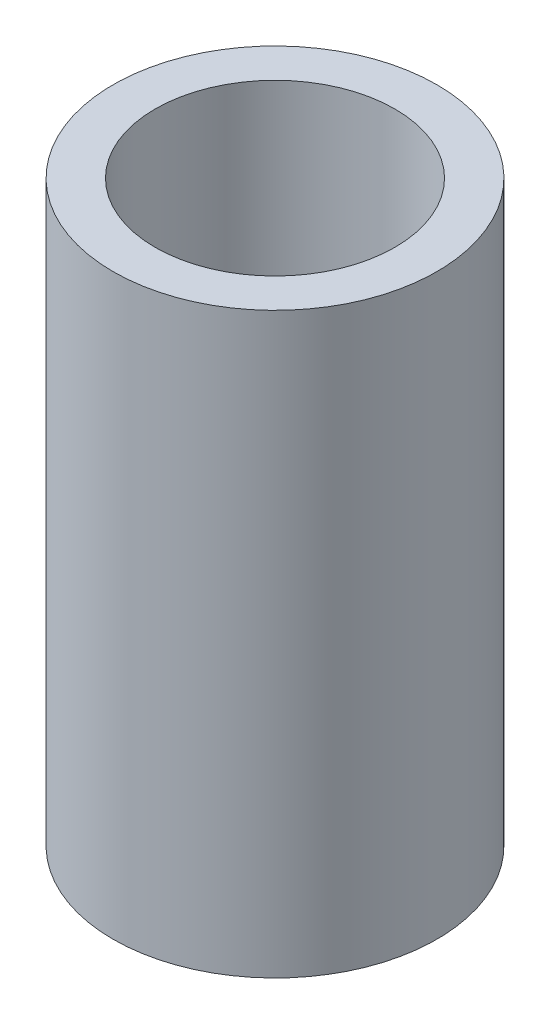
ISO-10303-21;
HEADER;
FILE_DESCRIPTION(('STEP AP214'),'2;1');
FILE_NAME('part.step','',(''),(''),'','','');
FILE_SCHEMA(('AUTOMOTIVE_DESIGN { 1 0 10303 214 1 1 1 1 }'));
ENDSEC;
DATA;
#1=APPLICATION_CONTEXT('core data for automotive mechanical design processes');
#2=APPLICATION_PROTOCOL_DEFINITION('international standard','automotive_design',2000,#1);
#3=PRODUCT_CONTEXT('',#1,'mechanical');
#4=PRODUCT('Part','Part','',(#3));
#5=PRODUCT_RELATED_PRODUCT_CATEGORY('part','',(#4));
#6=PRODUCT_DEFINITION_FORMATION('','',#4);
#7=PRODUCT_DEFINITION_CONTEXT('part definition',#1,'design');
#8=PRODUCT_DEFINITION('design','',#6,#7);
#9=PRODUCT_DEFINITION_SHAPE('','',#8);
#10=(LENGTH_UNIT() NAMED_UNIT(*) SI_UNIT(.MILLI.,.METRE.));
#11=(NAMED_UNIT(*) PLANE_ANGLE_UNIT() SI_UNIT($,.RADIAN.));
#12=(NAMED_UNIT(*) SI_UNIT($,.STERADIAN.) SOLID_ANGLE_UNIT());
#13=UNCERTAINTY_MEASURE_WITH_UNIT(LENGTH_MEASURE(1.E-05),#10,'distance_accuracy_value','');
#14=(GEOMETRIC_REPRESENTATION_CONTEXT(3) GLOBAL_UNCERTAINTY_ASSIGNED_CONTEXT((#13)) GLOBAL_UNIT_ASSIGNED_CONTEXT((#10,
#11,#12)) REPRESENTATION_CONTEXT('',''));
#15=CARTESIAN_POINT('',(0.,0.,0.));
#16=DIRECTION('',(0.,0.,1.));
#17=DIRECTION('',(1.,0.,0.));
#18=AXIS2_PLACEMENT_3D('',#15,#16,#17);
#19=CARTESIAN_POINT('',(0.,38.1,0.));
#20=DIRECTION('',(0.,1.,0.));
#21=DIRECTION('',(0.,0.,1.));
#22=AXIS2_PLACEMENT_3D('',#19,#20,#21);
#23=PLANE('',#22);
#24=CARTESIAN_POINT('',(0.,38.1,0.));
#25=DIRECTION('',(0.,1.,0.));
#26=DIRECTION('',(0.,0.,1.));
#27=AXIS2_PLACEMENT_3D('',#24,#25,#26);
#28=CIRCLE('',#27,10.668);
#29=CARTESIAN_POINT('',(0.,38.1,-10.668));
#30=VERTEX_POINT('',#29);
#31=EDGE_CURVE('E10',#30,#30,#28,.T.);
#32=ORIENTED_EDGE('',*,*,#31,.T.);
#33=EDGE_LOOP('',(#32));
#34=FACE_BOUND('',#33,.T.);
#35=CARTESIAN_POINT('',(0.,38.1,0.));
#36=DIRECTION('',(0.,1.,0.));
#37=DIRECTION('',(0.,0.,1.));
#38=AXIS2_PLACEMENT_3D('',#35,#36,#37);
#39=CIRCLE('',#38,7.8994);
#40=CARTESIAN_POINT('',(0.,38.1,-7.8994));
#41=VERTEX_POINT('',#40);
#42=EDGE_CURVE('E50',#41,#41,#39,.T.);
#43=ORIENTED_EDGE('',*,*,#42,.F.);
#44=EDGE_LOOP('',(#43));
#45=FACE_BOUND('',#44,.T.);
#46=ADVANCED_FACE('F37',(#34,#45),#23,.T.);
#47=CARTESIAN_POINT('',(0.,0.,0.));
#48=DIRECTION('',(0.,1.,0.));
#49=DIRECTION('',(0.,0.,1.));
#50=AXIS2_PLACEMENT_3D('',#47,#48,#49);
#51=PLANE('',#50);
#52=CARTESIAN_POINT('',(0.,0.,0.));
#53=DIRECTION('',(0.,1.,0.));
#54=DIRECTION('',(0.,0.,1.));
#55=AXIS2_PLACEMENT_3D('',#52,#53,#54);
#56=CIRCLE('',#55,10.668);
#57=CARTESIAN_POINT('',(0.,0.,-10.668));
#58=VERTEX_POINT('',#57);
#59=EDGE_CURVE('E41',#58,#58,#56,.T.);
#60=ORIENTED_EDGE('',*,*,#59,.F.);
#61=EDGE_LOOP('',(#60));
#62=FACE_BOUND('',#61,.T.);
#63=CARTESIAN_POINT('',(0.,0.,0.));
#64=DIRECTION('',(0.,1.,0.));
#65=DIRECTION('',(0.,0.,1.));
#66=AXIS2_PLACEMENT_3D('',#63,#64,#65);
#67=CIRCLE('',#66,7.8994);
#68=CARTESIAN_POINT('',(0.,0.,-7.8994));
#69=VERTEX_POINT('',#68);
#70=EDGE_CURVE('E52',#69,#69,#67,.T.);
#71=ORIENTED_EDGE('',*,*,#70,.T.);
#72=EDGE_LOOP('',(#71));
#73=FACE_BOUND('',#72,.T.);
#74=ADVANCED_FACE('F64',(#62,#73),#51,.F.);
#75=CARTESIAN_POINT('',(0.,38.1,0.));
#76=DIRECTION('',(0.,-1.,0.));
#77=DIRECTION('',(0.,0.,-1.));
#78=AXIS2_PLACEMENT_3D('',#75,#76,#77);
#79=CYLINDRICAL_SURFACE('',#78,10.668);
#80=CARTESIAN_POINT('',(0.,38.1,-10.668));
#81=CARTESIAN_POINT('',(0.,37.703125,-10.668));
#82=CARTESIAN_POINT('',(0.,37.30625,-10.668));
#83=CARTESIAN_POINT('',(0.,36.5125,-10.668));
#84=CARTESIAN_POINT('',(0.,36.115625,-10.668));
#85=CARTESIAN_POINT('',(0.,35.321875,-10.668));
#86=CARTESIAN_POINT('',(0.,34.925,-10.668));
#87=CARTESIAN_POINT('',(0.,34.13125,-10.668));
#88=CARTESIAN_POINT('',(0.,33.734375,-10.668));
#89=CARTESIAN_POINT('',(0.,32.940625,-10.668));
#90=CARTESIAN_POINT('',(0.,32.54375,-10.668));
#91=CARTESIAN_POINT('',(0.,31.75,-10.668));
#92=CARTESIAN_POINT('',(0.,31.353125,-10.668));
#93=CARTESIAN_POINT('',(0.,30.559375,-10.668));
#94=CARTESIAN_POINT('',(0.,30.1625,-10.668));
#95=CARTESIAN_POINT('',(0.,29.36875,-10.668));
#96=CARTESIAN_POINT('',(0.,28.971875,-10.668));
#97=CARTESIAN_POINT('',(0.,28.178125,-10.668));
#98=CARTESIAN_POINT('',(0.,27.78125,-10.668));
#99=CARTESIAN_POINT('',(0.,26.9875,-10.668));
#100=CARTESIAN_POINT('',(0.,26.590625,-10.668));
#101=CARTESIAN_POINT('',(0.,25.796875,-10.668));
#102=CARTESIAN_POINT('',(0.,25.4,-10.668));
#103=CARTESIAN_POINT('',(0.,24.60625,-10.668));
#104=CARTESIAN_POINT('',(0.,24.209375,-10.668));
#105=CARTESIAN_POINT('',(0.,23.415625,-10.668));
#106=CARTESIAN_POINT('',(0.,23.01875,-10.668));
#107=CARTESIAN_POINT('',(0.,22.225,-10.668));
#108=CARTESIAN_POINT('',(0.,21.828125,-10.668));
#109=CARTESIAN_POINT('',(0.,21.034375,-10.668));
#110=CARTESIAN_POINT('',(0.,20.6375,-10.668));
#111=CARTESIAN_POINT('',(0.,19.84375,-10.668));
#112=CARTESIAN_POINT('',(0.,19.446875,-10.668));
#113=CARTESIAN_POINT('',(0.,18.653125,-10.668));
#114=CARTESIAN_POINT('',(0.,18.25625,-10.668));
#115=CARTESIAN_POINT('',(0.,17.4625,-10.668));
#116=CARTESIAN_POINT('',(0.,17.065625,-10.668));
#117=CARTESIAN_POINT('',(0.,16.271875,-10.668));
#118=CARTESIAN_POINT('',(0.,15.875,-10.668));
#119=CARTESIAN_POINT('',(0.,15.08125,-10.668));
#120=CARTESIAN_POINT('',(0.,14.684375,-10.668));
#121=CARTESIAN_POINT('',(0.,13.890625,-10.668));
#122=CARTESIAN_POINT('',(0.,13.49375,-10.668));
#123=CARTESIAN_POINT('',(0.,12.7,-10.668));
#124=CARTESIAN_POINT('',(0.,12.303125,-10.668));
#125=CARTESIAN_POINT('',(0.,11.509375,-10.668));
#126=CARTESIAN_POINT('',(0.,11.1125,-10.668));
#127=CARTESIAN_POINT('',(0.,10.31875,-10.668));
#128=CARTESIAN_POINT('',(0.,9.92187499999999,-10.668));
#129=CARTESIAN_POINT('',(0.,9.128125,-10.668));
#130=CARTESIAN_POINT('',(0.,8.73124999999999,-10.668));
#131=CARTESIAN_POINT('',(0.,7.93749999999999,-10.668));
#132=CARTESIAN_POINT('',(0.,7.54062499999999,-10.668));
#133=CARTESIAN_POINT('',(0.,6.746875,-10.668));
#134=CARTESIAN_POINT('',(0.,6.35,-10.668));
#135=CARTESIAN_POINT('',(0.,5.55625,-10.668));
#136=CARTESIAN_POINT('',(0.,5.159375,-10.668));
#137=CARTESIAN_POINT('',(0.,4.365625,-10.668));
#138=CARTESIAN_POINT('',(0.,3.96875,-10.668));
#139=CARTESIAN_POINT('',(0.,3.175,-10.668));
#140=CARTESIAN_POINT('',(0.,2.778125,-10.668));
#141=CARTESIAN_POINT('',(0.,1.984375,-10.668));
#142=CARTESIAN_POINT('',(0.,1.5875,-10.668));
#143=CARTESIAN_POINT('',(0.,0.79375,-10.668));
#144=CARTESIAN_POINT('',(0.,0.396875,-10.668));
#145=CARTESIAN_POINT('',(0.,0.,-10.668));
#146=B_SPLINE_CURVE_WITH_KNOTS('',3,(#80,#81,#82,#83,#84,#85,#86,#87,#88,#89,#90,#91,#92,#93,
#94,#95,#96,#97,#98,#99,#100,#101,#102,#103,#104,#105,#106,#107,#108,#109,#110,#111,#112,#113,
#114,#115,#116,#117,#118,#119,#120,#121,#122,#123,#124,#125,#126,#127,#128,#129,#130,#131,#132,
#133,#134,#135,#136,#137,#138,#139,#140,#141,#142,#143,#144,#145),.UNSPECIFIED.,.F.,.F.,(4,2,2,
2,2,2,2,2,2,2,2,2,2,2,2,2,2,2,2,2,2,2,2,2,2,2,2,2,2,2,2,2,4),(0.,1.190625,2.38125,3.571875,
4.7625,5.953125,7.14375,8.334375,9.52500000000001,10.715625,11.90625,13.096875,14.2875,
15.478125,16.66875,17.859375,19.05,20.240625,21.43125,22.621875,23.8125,25.003125,26.19375,
27.384375,28.575,29.765625,30.95625,32.146875,33.3375,34.528125,35.71875,36.909375,38.1),.UNSPECIFIED.);
#147=EDGE_CURVE('BSEAM39',#30,#58,#146,.T.);
#148=ORIENTED_EDGE('',*,*,#31,.F.);
#149=ORIENTED_EDGE('',*,*,#59,.T.);
#150=ORIENTED_EDGE('',*,*,#147,.T.);
#151=ORIENTED_EDGE('',*,*,#147,.F.);
#152=EDGE_LOOP('',(#148,#150,#149,#151));
#153=FACE_BOUND('',#152,.T.);
#154=ADVANCED_FACE('F39',(#153),#79,.T.);
#155=CARTESIAN_POINT('',(0.,38.1,0.));
#156=DIRECTION('',(0.,-1.,0.));
#157=DIRECTION('',(0.,0.,-1.));
#158=AXIS2_PLACEMENT_3D('',#155,#156,#157);
#159=CYLINDRICAL_SURFACE('',#158,7.8994);
#160=CARTESIAN_POINT('',(0.,38.1,-7.8994));
#161=CARTESIAN_POINT('',(0.,37.703125,-7.8994));
#162=CARTESIAN_POINT('',(0.,37.30625,-7.8994));
#163=CARTESIAN_POINT('',(0.,36.5125,-7.8994));
#164=CARTESIAN_POINT('',(0.,36.115625,-7.8994));
#165=CARTESIAN_POINT('',(0.,35.321875,-7.8994));
#166=CARTESIAN_POINT('',(0.,34.925,-7.8994));
#167=CARTESIAN_POINT('',(0.,34.13125,-7.8994));
#168=CARTESIAN_POINT('',(0.,33.734375,-7.8994));
#169=CARTESIAN_POINT('',(0.,32.940625,-7.8994));
#170=CARTESIAN_POINT('',(0.,32.54375,-7.8994));
#171=CARTESIAN_POINT('',(0.,31.75,-7.8994));
#172=CARTESIAN_POINT('',(0.,31.353125,-7.8994));
#173=CARTESIAN_POINT('',(0.,30.559375,-7.8994));
#174=CARTESIAN_POINT('',(0.,30.1625,-7.8994));
#175=CARTESIAN_POINT('',(0.,29.36875,-7.8994));
#176=CARTESIAN_POINT('',(0.,28.971875,-7.8994));
#177=CARTESIAN_POINT('',(0.,28.178125,-7.8994));
#178=CARTESIAN_POINT('',(0.,27.78125,-7.8994));
#179=CARTESIAN_POINT('',(0.,26.9875,-7.8994));
#180=CARTESIAN_POINT('',(0.,26.590625,-7.8994));
#181=CARTESIAN_POINT('',(0.,25.796875,-7.8994));
#182=CARTESIAN_POINT('',(0.,25.4,-7.8994));
#183=CARTESIAN_POINT('',(0.,24.60625,-7.8994));
#184=CARTESIAN_POINT('',(0.,24.209375,-7.8994));
#185=CARTESIAN_POINT('',(0.,23.415625,-7.8994));
#186=CARTESIAN_POINT('',(0.,23.01875,-7.8994));
#187=CARTESIAN_POINT('',(0.,22.225,-7.8994));
#188=CARTESIAN_POINT('',(0.,21.828125,-7.8994));
#189=CARTESIAN_POINT('',(0.,21.034375,-7.8994));
#190=CARTESIAN_POINT('',(0.,20.6375,-7.8994));
#191=CARTESIAN_POINT('',(0.,19.84375,-7.8994));
#192=CARTESIAN_POINT('',(0.,19.446875,-7.8994));
#193=CARTESIAN_POINT('',(0.,18.653125,-7.8994));
#194=CARTESIAN_POINT('',(0.,18.25625,-7.8994));
#195=CARTESIAN_POINT('',(0.,17.4625,-7.8994));
#196=CARTESIAN_POINT('',(0.,17.065625,-7.8994));
#197=CARTESIAN_POINT('',(0.,16.271875,-7.8994));
#198=CARTESIAN_POINT('',(0.,15.875,-7.8994));
#199=CARTESIAN_POINT('',(0.,15.08125,-7.8994));
#200=CARTESIAN_POINT('',(0.,14.684375,-7.8994));
#201=CARTESIAN_POINT('',(0.,13.890625,-7.8994));
#202=CARTESIAN_POINT('',(0.,13.49375,-7.8994));
#203=CARTESIAN_POINT('',(0.,12.7,-7.8994));
#204=CARTESIAN_POINT('',(0.,12.303125,-7.8994));
#205=CARTESIAN_POINT('',(0.,11.509375,-7.8994));
#206=CARTESIAN_POINT('',(0.,11.1125,-7.8994));
#207=CARTESIAN_POINT('',(0.,10.31875,-7.8994));
#208=CARTESIAN_POINT('',(0.,9.921875,-7.8994));
#209=CARTESIAN_POINT('',(0.,9.128125,-7.8994));
#210=CARTESIAN_POINT('',(0.,8.73125,-7.8994));
#211=CARTESIAN_POINT('',(0.,7.9375,-7.8994));
#212=CARTESIAN_POINT('',(0.,7.540625,-7.8994));
#213=CARTESIAN_POINT('',(0.,6.746875,-7.8994));
#214=CARTESIAN_POINT('',(0.,6.35,-7.8994));
#215=CARTESIAN_POINT('',(0.,5.55625,-7.8994));
#216=CARTESIAN_POINT('',(0.,5.159375,-7.8994));
#217=CARTESIAN_POINT('',(0.,4.365625,-7.8994));
#218=CARTESIAN_POINT('',(0.,3.96875,-7.8994));
#219=CARTESIAN_POINT('',(0.,3.175,-7.8994));
#220=CARTESIAN_POINT('',(0.,2.778125,-7.8994));
#221=CARTESIAN_POINT('',(0.,1.984375,-7.8994));
#222=CARTESIAN_POINT('',(0.,1.5875,-7.8994));
#223=CARTESIAN_POINT('',(0.,0.79375,-7.8994));
#224=CARTESIAN_POINT('',(0.,0.396875,-7.8994));
#225=CARTESIAN_POINT('',(0.,0.,-7.8994));
#226=B_SPLINE_CURVE_WITH_KNOTS('',3,(#160,#161,#162,#163,#164,#165,#166,#167,#168,#169,#170,
#171,#172,#173,#174,#175,#176,#177,#178,#179,#180,#181,#182,#183,#184,#185,#186,#187,#188,#189,
#190,#191,#192,#193,#194,#195,#196,#197,#198,#199,#200,#201,#202,#203,#204,#205,#206,#207,#208,
#209,#210,#211,#212,#213,#214,#215,#216,#217,#218,#219,#220,#221,#222,#223,#224,#225),
.UNSPECIFIED.,.F.,.F.,(4,2,2,2,2,2,2,2,2,2,2,2,2,2,2,2,2,2,2,2,2,2,2,2,2,2,2,2,2,2,2,2,4),(0.,
1.19062499999999,2.38124999999999,3.571875,4.7625,5.953125,7.14375,8.33437499999999,9.525,
10.715625,11.90625,13.096875,14.2875,15.478125,16.66875,17.859375,19.05,20.240625,21.43125,
22.621875,23.8125,25.003125,26.19375,27.384375,28.575,29.765625,30.95625,32.146875,33.3375,
34.528125,35.71875,36.909375,38.1),.UNSPECIFIED.);
#227=EDGE_CURVE('BSEAM60',#41,#69,#226,.T.);
#228=ORIENTED_EDGE('',*,*,#42,.T.);
#229=ORIENTED_EDGE('',*,*,#70,.F.);
#230=ORIENTED_EDGE('',*,*,#227,.T.);
#231=ORIENTED_EDGE('',*,*,#227,.F.);
#232=EDGE_LOOP('',(#228,#230,#229,#231));
#233=FACE_BOUND('',#232,.T.);
#234=ADVANCED_FACE('F60',(#233),#159,.F.);
#235=CLOSED_SHELL('',(#46,#74,#154,#234));
#236=MANIFOLD_SOLID_BREP('B2',#235);
#237=ADVANCED_BREP_SHAPE_REPRESENTATION('',(#18,#236),#14);
#238=SHAPE_DEFINITION_REPRESENTATION(#9,#237);
ENDSEC;
END-ISO-10303-21;
